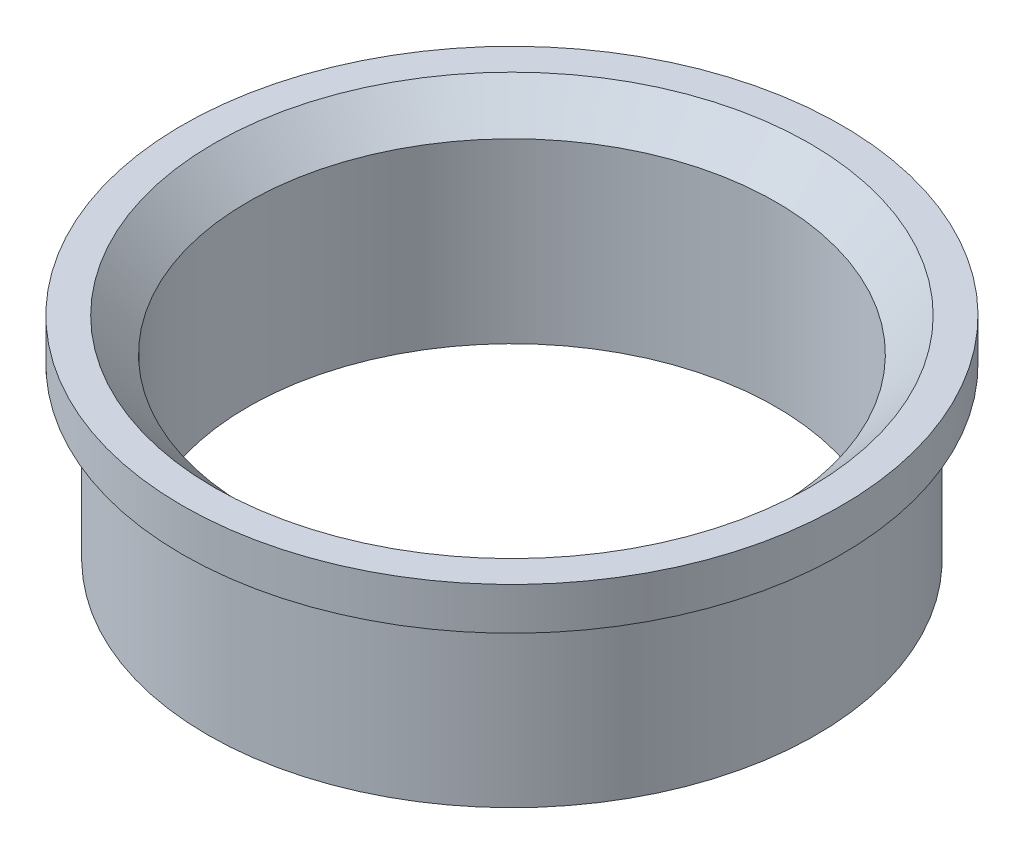
ISO-10303-21;
HEADER;
FILE_DESCRIPTION(('STEP AP214'),'2;1');
FILE_NAME('part.step','',(''),(''),'','','');
FILE_SCHEMA(('AUTOMOTIVE_DESIGN { 1 0 10303 214 1 1 1 1 }'));
ENDSEC;
DATA;
#1=APPLICATION_CONTEXT('core data for automotive mechanical design processes');
#2=APPLICATION_PROTOCOL_DEFINITION('international standard','automotive_design',2000,#1);
#3=PRODUCT_CONTEXT('',#1,'mechanical');
#4=PRODUCT('Part','Part','',(#3));
#5=PRODUCT_RELATED_PRODUCT_CATEGORY('part','',(#4));
#6=PRODUCT_DEFINITION_FORMATION('','',#4);
#7=PRODUCT_DEFINITION_CONTEXT('part definition',#1,'design');
#8=PRODUCT_DEFINITION('design','',#6,#7);
#9=PRODUCT_DEFINITION_SHAPE('','',#8);
#10=(LENGTH_UNIT() NAMED_UNIT(*) SI_UNIT(.MILLI.,.METRE.));
#11=(NAMED_UNIT(*) PLANE_ANGLE_UNIT() SI_UNIT($,.RADIAN.));
#12=(NAMED_UNIT(*) SI_UNIT($,.STERADIAN.) SOLID_ANGLE_UNIT());
#13=UNCERTAINTY_MEASURE_WITH_UNIT(LENGTH_MEASURE(1.E-05),#10,'distance_accuracy_value','');
#14=(GEOMETRIC_REPRESENTATION_CONTEXT(3) GLOBAL_UNCERTAINTY_ASSIGNED_CONTEXT((#13)) GLOBAL_UNIT_ASSIGNED_CONTEXT((#10,
#11,#12)) REPRESENTATION_CONTEXT('',''));
#15=CARTESIAN_POINT('',(0.,0.,0.));
#16=DIRECTION('',(0.,0.,1.));
#17=DIRECTION('',(1.,0.,0.));
#18=AXIS2_PLACEMENT_3D('',#15,#16,#17);
#19=CARTESIAN_POINT('',(72.,0.,0.));
#20=DIRECTION('',(0.,1.,0.));
#21=DIRECTION('',(0.,0.,1.));
#22=AXIS2_PLACEMENT_3D('',#19,#20,#21);
#23=PLANE('',#22);
#24=CARTESIAN_POINT('',(0.,0.,0.));
#25=DIRECTION('',(0.,1.,0.));
#26=DIRECTION('',(0.,0.,1.));
#27=AXIS2_PLACEMENT_3D('',#24,#25,#26);
#28=CIRCLE('',#27,72.);
#29=CARTESIAN_POINT('',(0.,0.,72.));
#30=VERTEX_POINT('',#29);
#31=EDGE_CURVE('E56',#30,#30,#28,.T.);
#32=ORIENTED_EDGE('',*,*,#31,.F.);
#33=EDGE_LOOP('',(#32));
#34=FACE_BOUND('',#33,.T.);
#35=CARTESIAN_POINT('',(0.,0.,0.));
#36=DIRECTION('',(0.,1.,0.));
#37=DIRECTION('',(0.,0.,1.));
#38=AXIS2_PLACEMENT_3D('',#35,#36,#37);
#39=CIRCLE('',#38,62.5);
#40=CARTESIAN_POINT('',(0.,0.,62.5));
#41=VERTEX_POINT('',#40);
#42=EDGE_CURVE('E10',#41,#41,#39,.T.);
#43=ORIENTED_EDGE('',*,*,#42,.T.);
#44=EDGE_LOOP('',(#43));
#45=FACE_BOUND('',#44,.T.);
#46=ADVANCED_FACE('F31',(#34,#45),#23,.F.);
#47=CARTESIAN_POINT('',(0.,43.1754562220659,0.));
#48=DIRECTION('',(0.,1.,0.));
#49=DIRECTION('',(0.,0.,1.));
#50=AXIS2_PLACEMENT_3D('',#47,#48,#49);
#51=CYLINDRICAL_SURFACE('',#50,62.5);
#52=ORIENTED_EDGE('',*,*,#42,.F.);
#53=EDGE_LOOP('',(#52));
#54=FACE_BOUND('',#53,.T.);
#55=CARTESIAN_POINT('',(0.,42.,0.));
#56=DIRECTION('',(0.,1.,0.));
#57=DIRECTION('',(0.,0.,1.));
#58=AXIS2_PLACEMENT_3D('',#55,#56,#57);
#59=CIRCLE('',#58,62.5);
#60=CARTESIAN_POINT('',(0.,42.,62.5));
#61=VERTEX_POINT('',#60);
#62=EDGE_CURVE('E37',#61,#61,#59,.T.);
#63=ORIENTED_EDGE('',*,*,#62,.T.);
#64=EDGE_LOOP('',(#63));
#65=FACE_BOUND('',#64,.T.);
#66=ADVANCED_FACE('F63',(#54,#65),#51,.F.);
#67=CARTESIAN_POINT('',(0.,50.,0.));
#68=DIRECTION('',(0.,1.,0.));
#69=DIRECTION('',(0.,0.,1.));
#70=AXIS2_PLACEMENT_3D('',#67,#68,#69);
#71=CONICAL_SURFACE('',#70,70.5,0.78539816339745);
#72=ORIENTED_EDGE('',*,*,#62,.F.);
#73=EDGE_LOOP('',(#72));
#74=FACE_BOUND('',#73,.T.);
#75=CARTESIAN_POINT('',(0.,50.,0.));
#76=DIRECTION('',(0.,1.,0.));
#77=DIRECTION('',(0.,0.,1.));
#78=AXIS2_PLACEMENT_3D('',#75,#76,#77);
#79=CIRCLE('',#78,70.5);
#80=CARTESIAN_POINT('',(0.,50.,70.5));
#81=VERTEX_POINT('',#80);
#82=EDGE_CURVE('E41',#81,#81,#79,.T.);
#83=ORIENTED_EDGE('',*,*,#82,.T.);
#84=EDGE_LOOP('',(#83));
#85=FACE_BOUND('',#84,.T.);
#86=ADVANCED_FACE('F67',(#74,#85),#71,.F.);
#87=CARTESIAN_POINT('',(70.5,50.,0.));
#88=DIRECTION('',(0.,-1.,0.));
#89=DIRECTION('',(0.,0.,-1.));
#90=AXIS2_PLACEMENT_3D('',#87,#88,#89);
#91=PLANE('',#90);
#92=ORIENTED_EDGE('',*,*,#82,.F.);
#93=EDGE_LOOP('',(#92));
#94=FACE_BOUND('',#93,.T.);
#95=CARTESIAN_POINT('',(0.,50.,0.));
#96=DIRECTION('',(0.,1.,0.));
#97=DIRECTION('',(0.,0.,1.));
#98=AXIS2_PLACEMENT_3D('',#95,#96,#97);
#99=CIRCLE('',#98,78.);
#100=CARTESIAN_POINT('',(0.,50.,78.));
#101=VERTEX_POINT('',#100);
#102=EDGE_CURVE('E45',#101,#101,#99,.T.);
#103=ORIENTED_EDGE('',*,*,#102,.T.);
#104=EDGE_LOOP('',(#103));
#105=FACE_BOUND('',#104,.T.);
#106=ADVANCED_FACE('F72',(#94,#105),#91,.F.);
#107=CARTESIAN_POINT('',(0.,43.1754562220659,0.));
#108=DIRECTION('',(0.,1.,0.));
#109=DIRECTION('',(0.,0.,1.));
#110=AXIS2_PLACEMENT_3D('',#107,#108,#109);
#111=CYLINDRICAL_SURFACE('',#110,78.);
#112=ORIENTED_EDGE('',*,*,#102,.F.);
#113=EDGE_LOOP('',(#112));
#114=FACE_BOUND('',#113,.T.);
#115=CARTESIAN_POINT('',(0.,40.,0.));
#116=DIRECTION('',(0.,1.,0.));
#117=DIRECTION('',(0.,0.,1.));
#118=AXIS2_PLACEMENT_3D('',#115,#116,#117);
#119=CIRCLE('',#118,78.);
#120=CARTESIAN_POINT('',(0.,40.,78.));
#121=VERTEX_POINT('',#120);
#122=EDGE_CURVE('E50',#121,#121,#119,.T.);
#123=ORIENTED_EDGE('',*,*,#122,.T.);
#124=EDGE_LOOP('',(#123));
#125=FACE_BOUND('',#124,.T.);
#126=ADVANCED_FACE('F78',(#114,#125),#111,.T.);
#127=CARTESIAN_POINT('',(78.,40.,0.));
#128=DIRECTION('',(0.,1.,0.));
#129=DIRECTION('',(0.,0.,1.));
#130=AXIS2_PLACEMENT_3D('',#127,#128,#129);
#131=PLANE('',#130);
#132=ORIENTED_EDGE('',*,*,#122,.F.);
#133=EDGE_LOOP('',(#132));
#134=FACE_BOUND('',#133,.T.);
#135=CARTESIAN_POINT('',(0.,40.,0.));
#136=DIRECTION('',(0.,1.,0.));
#137=DIRECTION('',(0.,0.,1.));
#138=AXIS2_PLACEMENT_3D('',#135,#136,#137);
#139=CIRCLE('',#138,72.);
#140=CARTESIAN_POINT('',(0.,40.,72.));
#141=VERTEX_POINT('',#140);
#142=EDGE_CURVE('E53',#141,#141,#139,.T.);
#143=ORIENTED_EDGE('',*,*,#142,.T.);
#144=EDGE_LOOP('',(#143));
#145=FACE_BOUND('',#144,.T.);
#146=ADVANCED_FACE('F82',(#134,#145),#131,.F.);
#147=CARTESIAN_POINT('',(0.,43.1754562220659,0.));
#148=DIRECTION('',(0.,1.,0.));
#149=DIRECTION('',(0.,0.,1.));
#150=AXIS2_PLACEMENT_3D('',#147,#148,#149);
#151=CYLINDRICAL_SURFACE('',#150,72.);
#152=ORIENTED_EDGE('',*,*,#142,.F.);
#153=EDGE_LOOP('',(#152));
#154=FACE_BOUND('',#153,.T.);
#155=ORIENTED_EDGE('',*,*,#31,.T.);
#156=EDGE_LOOP('',(#155));
#157=FACE_BOUND('',#156,.T.);
#158=ADVANCED_FACE('F60',(#154,#157),#151,.T.);
#159=CLOSED_SHELL('',(#46,#66,#86,#106,#126,#146,#158));
#160=MANIFOLD_SOLID_BREP('B2',#159);
#161=ADVANCED_BREP_SHAPE_REPRESENTATION('',(#18,#160),#14);
#162=SHAPE_DEFINITION_REPRESENTATION(#9,#161);
ENDSEC;
END-ISO-10303-21;
